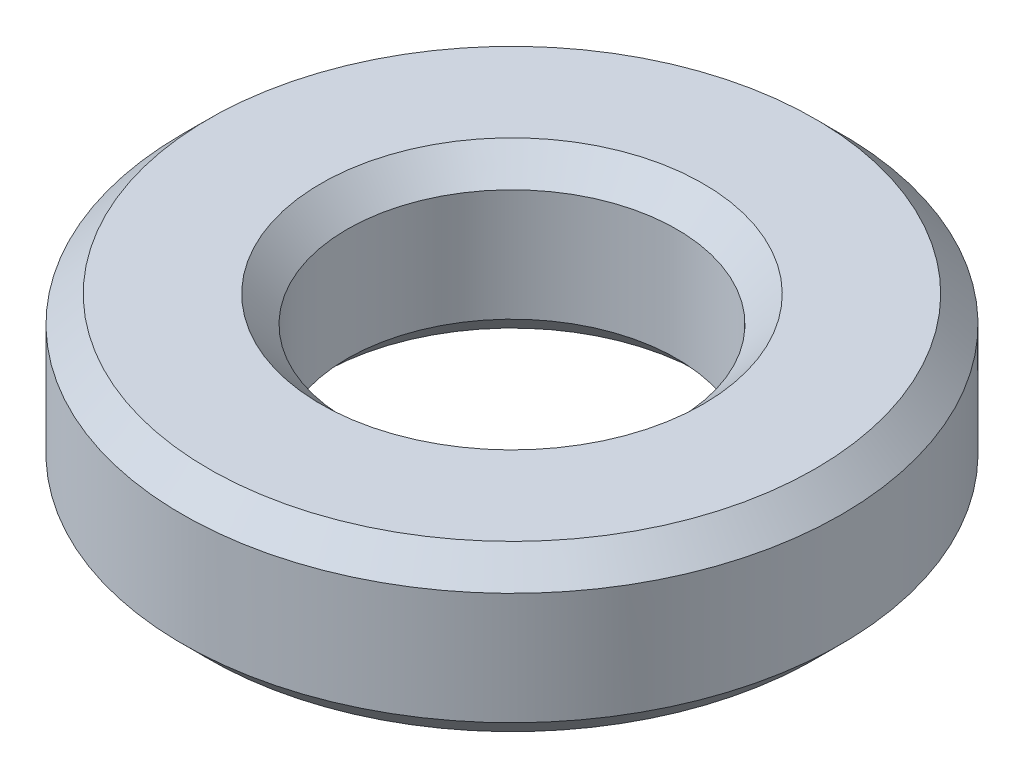
ISO-10303-21;
HEADER;
FILE_DESCRIPTION(('STEP AP214'),'2;1');
FILE_NAME('part.step','',(''),(''),'','','');
FILE_SCHEMA(('AUTOMOTIVE_DESIGN { 1 0 10303 214 1 1 1 1 }'));
ENDSEC;
DATA;
#1=APPLICATION_CONTEXT('core data for automotive mechanical design processes');
#2=APPLICATION_PROTOCOL_DEFINITION('international standard','automotive_design',2000,#1);
#3=PRODUCT_CONTEXT('',#1,'mechanical');
#4=PRODUCT('Part','Part','',(#3));
#5=PRODUCT_RELATED_PRODUCT_CATEGORY('part','',(#4));
#6=PRODUCT_DEFINITION_FORMATION('','',#4);
#7=PRODUCT_DEFINITION_CONTEXT('part definition',#1,'design');
#8=PRODUCT_DEFINITION('design','',#6,#7);
#9=PRODUCT_DEFINITION_SHAPE('','',#8);
#10=(LENGTH_UNIT() NAMED_UNIT(*) SI_UNIT(.MILLI.,.METRE.));
#11=(NAMED_UNIT(*) PLANE_ANGLE_UNIT() SI_UNIT($,.RADIAN.));
#12=(NAMED_UNIT(*) SI_UNIT($,.STERADIAN.) SOLID_ANGLE_UNIT());
#13=UNCERTAINTY_MEASURE_WITH_UNIT(LENGTH_MEASURE(1.E-05),#10,'distance_accuracy_value','');
#14=(GEOMETRIC_REPRESENTATION_CONTEXT(3) GLOBAL_UNCERTAINTY_ASSIGNED_CONTEXT((#13)) GLOBAL_UNIT_ASSIGNED_CONTEXT((#10,
#11,#12)) REPRESENTATION_CONTEXT('',''));
#15=CARTESIAN_POINT('',(0.,0.,0.));
#16=DIRECTION('',(0.,0.,1.));
#17=DIRECTION('',(1.,0.,0.));
#18=AXIS2_PLACEMENT_3D('',#15,#16,#17);
#19=CARTESIAN_POINT('',(1.5875,-0.79375,0.));
#20=DIRECTION('',(0.,1.,0.));
#21=DIRECTION('',(-1.,0.,0.));
#22=AXIS2_PLACEMENT_3D('',#19,#20,#21);
#23=PLANE('',#22);
#24=CARTESIAN_POINT('',(0.,-0.79375,0.));
#25=DIRECTION('',(0.,1.,0.));
#26=DIRECTION('',(-1.,0.,0.));
#27=AXIS2_PLACEMENT_3D('',#24,#25,#26);
#28=CIRCLE('',#27,2.921);
#29=CARTESIAN_POINT('',(-2.921,-0.793750000000001,0.));
#30=VERTEX_POINT('',#29);
#31=EDGE_CURVE('E50',#30,#30,#28,.F.);
#32=ORIENTED_EDGE('',*,*,#31,.T.);
#33=EDGE_LOOP('',(#32));
#34=FACE_BOUND('',#33,.T.);
#35=CARTESIAN_POINT('',(0.,-0.79375,0.));
#36=DIRECTION('',(0.,1.,0.));
#37=DIRECTION('',(-1.,0.,0.));
#38=AXIS2_PLACEMENT_3D('',#35,#36,#37);
#39=CIRCLE('',#38,1.8415);
#40=CARTESIAN_POINT('',(1.8415,-0.79375,0.));
#41=VERTEX_POINT('',#40);
#42=EDGE_CURVE('E53',#41,#41,#39,.T.);
#43=ORIENTED_EDGE('',*,*,#42,.T.);
#44=EDGE_LOOP('',(#43));
#45=FACE_BOUND('',#44,.T.);
#46=ADVANCED_FACE('F30',(#34,#45),#23,.F.);
#47=CARTESIAN_POINT('',(0.,1.64456699346434,0.));
#48=DIRECTION('',(0.,1.,0.));
#49=DIRECTION('',(-1.,0.,0.));
#50=AXIS2_PLACEMENT_3D('',#47,#48,#49);
#51=CYLINDRICAL_SURFACE('',#50,1.5875);
#52=CARTESIAN_POINT('',(0.,0.53975,0.));
#53=DIRECTION('',(0.,-1.,0.));
#54=DIRECTION('',(1.,0.,0.));
#55=AXIS2_PLACEMENT_3D('',#52,#53,#54);
#56=CIRCLE('',#55,1.5875);
#57=CARTESIAN_POINT('',(1.5875,0.539750000000001,0.));
#58=VERTEX_POINT('',#57);
#59=EDGE_CURVE('E10',#58,#58,#56,.F.);
#60=ORIENTED_EDGE('',*,*,#59,.T.);
#61=EDGE_LOOP('',(#60));
#62=FACE_BOUND('',#61,.T.);
#63=CARTESIAN_POINT('',(0.,-0.539749999999998,0.));
#64=DIRECTION('',(0.,1.,0.));
#65=DIRECTION('',(-1.,0.,0.));
#66=AXIS2_PLACEMENT_3D('',#63,#64,#65);
#67=CIRCLE('',#66,1.5875);
#68=CARTESIAN_POINT('',(1.5875,-0.539749999999998,0.));
#69=VERTEX_POINT('',#68);
#70=EDGE_CURVE('E37',#69,#69,#67,.F.);
#71=ORIENTED_EDGE('',*,*,#70,.T.);
#72=EDGE_LOOP('',(#71));
#73=FACE_BOUND('',#72,.T.);
#74=ADVANCED_FACE('F76',(#62,#73),#51,.F.);
#75=CARTESIAN_POINT('',(3.175,0.79375,0.));
#76=DIRECTION('',(0.,-1.,0.));
#77=DIRECTION('',(1.,0.,0.));
#78=AXIS2_PLACEMENT_3D('',#75,#76,#77);
#79=PLANE('',#78);
#80=CARTESIAN_POINT('',(0.,0.793749999999999,0.));
#81=DIRECTION('',(0.,-1.,0.));
#82=DIRECTION('',(1.,0.,0.));
#83=AXIS2_PLACEMENT_3D('',#80,#81,#82);
#84=CIRCLE('',#83,2.921);
#85=CARTESIAN_POINT('',(2.921,0.79375,0.));
#86=VERTEX_POINT('',#85);
#87=EDGE_CURVE('E41',#86,#86,#84,.F.);
#88=ORIENTED_EDGE('',*,*,#87,.T.);
#89=EDGE_LOOP('',(#88));
#90=FACE_BOUND('',#89,.T.);
#91=CARTESIAN_POINT('',(0.,0.793749999999999,0.));
#92=DIRECTION('',(0.,-1.,0.));
#93=DIRECTION('',(1.,0.,0.));
#94=AXIS2_PLACEMENT_3D('',#91,#92,#93);
#95=CIRCLE('',#94,1.8415);
#96=CARTESIAN_POINT('',(1.8415,0.79375,0.));
#97=VERTEX_POINT('',#96);
#98=EDGE_CURVE('E45',#97,#97,#95,.T.);
#99=ORIENTED_EDGE('',*,*,#98,.T.);
#100=EDGE_LOOP('',(#99));
#101=FACE_BOUND('',#100,.T.);
#102=ADVANCED_FACE('F73',(#90,#101),#79,.F.);
#103=CARTESIAN_POINT('',(0.,1.64456699346434,0.));
#104=DIRECTION('',(0.,1.,0.));
#105=DIRECTION('',(-1.,0.,0.));
#106=AXIS2_PLACEMENT_3D('',#103,#104,#105);
#107=CYLINDRICAL_SURFACE('',#106,3.175);
#108=CARTESIAN_POINT('',(0.,-0.53975,0.));
#109=DIRECTION('',(0.,1.,0.));
#110=DIRECTION('',(-1.,0.,0.));
#111=AXIS2_PLACEMENT_3D('',#108,#109,#110);
#112=CIRCLE('',#111,3.175);
#113=CARTESIAN_POINT('',(-3.175,-0.539750000000001,0.));
#114=VERTEX_POINT('',#113);
#115=EDGE_CURVE('E56',#114,#114,#112,.T.);
#116=ORIENTED_EDGE('',*,*,#115,.T.);
#117=EDGE_LOOP('',(#116));
#118=FACE_BOUND('',#117,.T.);
#119=CARTESIAN_POINT('',(0.,0.539749999999998,0.));
#120=DIRECTION('',(0.,-1.,0.));
#121=DIRECTION('',(1.,0.,0.));
#122=AXIS2_PLACEMENT_3D('',#119,#120,#121);
#123=CIRCLE('',#122,3.175);
#124=CARTESIAN_POINT('',(3.175,0.539749999999999,0.));
#125=VERTEX_POINT('',#124);
#126=EDGE_CURVE('E59',#125,#125,#123,.T.);
#127=ORIENTED_EDGE('',*,*,#126,.T.);
#128=EDGE_LOOP('',(#127));
#129=FACE_BOUND('',#128,.T.);
#130=ADVANCED_FACE('F63',(#118,#129),#107,.T.);
#131=CARTESIAN_POINT('',(0.,-0.53975,0.));
#132=DIRECTION('',(0.,1.,0.));
#133=DIRECTION('',(-1.,0.,0.));
#134=AXIS2_PLACEMENT_3D('',#131,#132,#133);
#135=CONICAL_SURFACE('',#134,3.175,0.785398163397452);
#136=ORIENTED_EDGE('',*,*,#31,.F.);
#137=EDGE_LOOP('',(#136));
#138=FACE_BOUND('',#137,.T.);
#139=ORIENTED_EDGE('',*,*,#115,.F.);
#140=EDGE_LOOP('',(#139));
#141=FACE_BOUND('',#140,.T.);
#142=ADVANCED_FACE('F69',(#138,#141),#135,.T.);
#143=CARTESIAN_POINT('',(0.,0.793749999999999,0.));
#144=DIRECTION('',(0.,-1.,0.));
#145=DIRECTION('',(1.,0.,0.));
#146=AXIS2_PLACEMENT_3D('',#143,#144,#145);
#147=CONICAL_SURFACE('',#146,2.921,0.785398163397447);
#148=ORIENTED_EDGE('',*,*,#126,.F.);
#149=EDGE_LOOP('',(#148));
#150=FACE_BOUND('',#149,.T.);
#151=ORIENTED_EDGE('',*,*,#87,.F.);
#152=EDGE_LOOP('',(#151));
#153=FACE_BOUND('',#152,.T.);
#154=ADVANCED_FACE('F65',(#150,#153),#147,.T.);
#155=CARTESIAN_POINT('',(0.,0.53975,0.));
#156=DIRECTION('',(0.,1.,0.));
#157=DIRECTION('',(-1.,0.,0.));
#158=AXIS2_PLACEMENT_3D('',#155,#156,#157);
#159=CONICAL_SURFACE('',#158,1.5875,0.785398163397451);
#160=ORIENTED_EDGE('',*,*,#98,.F.);
#161=EDGE_LOOP('',(#160));
#162=FACE_BOUND('',#161,.T.);
#163=ORIENTED_EDGE('',*,*,#59,.F.);
#164=EDGE_LOOP('',(#163));
#165=FACE_BOUND('',#164,.T.);
#166=ADVANCED_FACE('F68',(#162,#165),#159,.F.);
#167=CARTESIAN_POINT('',(0.,-0.79375,0.));
#168=DIRECTION('',(0.,-1.,0.));
#169=DIRECTION('',(1.,0.,0.));
#170=AXIS2_PLACEMENT_3D('',#167,#168,#169);
#171=CONICAL_SURFACE('',#170,1.8415,0.785398163397446);
#172=CARTESIAN_POINT('',(1.5875,-0.539749999999998,0.));
#173=CARTESIAN_POINT('',(1.59014583333333,-0.542395833333331,0.));
#174=CARTESIAN_POINT('',(1.59279166666667,-0.545041666666664,0.));
#175=CARTESIAN_POINT('',(1.59808333333333,-0.550333333333331,0.));
#176=CARTESIAN_POINT('',(1.60072916666667,-0.552979166666664,0.));
#177=CARTESIAN_POINT('',(1.60602083333333,-0.558270833333331,0.));
#178=CARTESIAN_POINT('',(1.60866666666667,-0.560916666666665,0.));
#179=CARTESIAN_POINT('',(1.61395833333333,-0.566208333333331,0.));
#180=CARTESIAN_POINT('',(1.61660416666667,-0.568854166666665,0.));
#181=CARTESIAN_POINT('',(1.62189583333333,-0.574145833333331,0.));
#182=CARTESIAN_POINT('',(1.62454166666667,-0.576791666666665,0.));
#183=CARTESIAN_POINT('',(1.62983333333333,-0.582083333333331,0.));
#184=CARTESIAN_POINT('',(1.63247916666667,-0.584729166666665,0.));
#185=CARTESIAN_POINT('',(1.63777083333333,-0.590020833333331,0.));
#186=CARTESIAN_POINT('',(1.64041666666667,-0.592666666666665,0.));
#187=CARTESIAN_POINT('',(1.64570833333333,-0.597958333333331,0.));
#188=CARTESIAN_POINT('',(1.64835416666667,-0.600604166666665,0.));
#189=CARTESIAN_POINT('',(1.65364583333333,-0.605895833333331,0.));
#190=CARTESIAN_POINT('',(1.65629166666667,-0.608541666666665,0.));
#191=CARTESIAN_POINT('',(1.66158333333333,-0.613833333333331,0.));
#192=CARTESIAN_POINT('',(1.66422916666667,-0.616479166666665,0.));
#193=CARTESIAN_POINT('',(1.66952083333333,-0.621770833333332,0.));
#194=CARTESIAN_POINT('',(1.67216666666667,-0.624416666666665,0.));
#195=CARTESIAN_POINT('',(1.67745833333333,-0.629708333333332,0.));
#196=CARTESIAN_POINT('',(1.68010416666667,-0.632354166666665,0.));
#197=CARTESIAN_POINT('',(1.68539583333333,-0.637645833333332,0.));
#198=CARTESIAN_POINT('',(1.68804166666667,-0.640291666666665,0.));
#199=CARTESIAN_POINT('',(1.69333333333333,-0.645583333333332,0.));
#200=CARTESIAN_POINT('',(1.69597916666667,-0.648229166666665,0.));
#201=CARTESIAN_POINT('',(1.70127083333333,-0.653520833333332,0.));
#202=CARTESIAN_POINT('',(1.70391666666667,-0.656166666666665,0.));
#203=CARTESIAN_POINT('',(1.70920833333333,-0.661458333333332,0.));
#204=CARTESIAN_POINT('',(1.71185416666667,-0.664104166666665,0.));
#205=CARTESIAN_POINT('',(1.71714583333333,-0.669395833333332,0.));
#206=CARTESIAN_POINT('',(1.71979166666667,-0.672041666666665,0.));
#207=CARTESIAN_POINT('',(1.72508333333333,-0.677333333333332,0.));
#208=CARTESIAN_POINT('',(1.72772916666667,-0.679979166666665,0.));
#209=CARTESIAN_POINT('',(1.73302083333333,-0.685270833333332,0.));
#210=CARTESIAN_POINT('',(1.73566666666667,-0.687916666666666,0.));
#211=CARTESIAN_POINT('',(1.74095833333333,-0.693208333333332,0.));
#212=CARTESIAN_POINT('',(1.74360416666667,-0.695854166666666,0.));
#213=CARTESIAN_POINT('',(1.74889583333333,-0.701145833333332,0.));
#214=CARTESIAN_POINT('',(1.75154166666667,-0.703791666666666,0.));
#215=CARTESIAN_POINT('',(1.75683333333333,-0.709083333333332,0.));
#216=CARTESIAN_POINT('',(1.75947916666667,-0.711729166666666,0.));
#217=CARTESIAN_POINT('',(1.76477083333333,-0.717020833333332,0.));
#218=CARTESIAN_POINT('',(1.76741666666667,-0.719666666666666,0.));
#219=CARTESIAN_POINT('',(1.77270833333333,-0.724958333333333,0.));
#220=CARTESIAN_POINT('',(1.77535416666667,-0.727604166666666,0.));
#221=CARTESIAN_POINT('',(1.78064583333333,-0.732895833333333,0.));
#222=CARTESIAN_POINT('',(1.78329166666667,-0.735541666666666,0.));
#223=CARTESIAN_POINT('',(1.78858333333333,-0.740833333333333,0.));
#224=CARTESIAN_POINT('',(1.79122916666667,-0.743479166666666,0.));
#225=CARTESIAN_POINT('',(1.79652083333333,-0.748770833333333,0.));
#226=CARTESIAN_POINT('',(1.79916666666667,-0.751416666666666,0.));
#227=CARTESIAN_POINT('',(1.80445833333333,-0.756708333333333,0.));
#228=CARTESIAN_POINT('',(1.80710416666667,-0.759354166666666,0.));
#229=CARTESIAN_POINT('',(1.81239583333333,-0.764645833333333,0.));
#230=CARTESIAN_POINT('',(1.81504166666667,-0.767291666666666,0.));
#231=CARTESIAN_POINT('',(1.82033333333333,-0.772583333333333,0.));
#232=CARTESIAN_POINT('',(1.82297916666667,-0.775229166666666,0.));
#233=CARTESIAN_POINT('',(1.82827083333333,-0.780520833333333,0.));
#234=CARTESIAN_POINT('',(1.83091666666667,-0.783166666666666,0.));
#235=CARTESIAN_POINT('',(1.83620833333333,-0.788458333333333,0.));
#236=CARTESIAN_POINT('',(1.83885416666667,-0.791104166666666,0.));
#237=CARTESIAN_POINT('',(1.8415,-0.79375,0.));
#238=B_SPLINE_CURVE_WITH_KNOTS('',3,(#172,#173,#174,#175,#176,#177,#178,#179,#180,#181,#182,
#183,#184,#185,#186,#187,#188,#189,#190,#191,#192,#193,#194,#195,#196,#197,#198,#199,#200,#201,
#202,#203,#204,#205,#206,#207,#208,#209,#210,#211,#212,#213,#214,#215,#216,#217,#218,#219,#220,
#221,#222,#223,#224,#225,#226,#227,#228,#229,#230,#231,#232,#233,#234,#235,#236,#237),
.UNSPECIFIED.,.F.,.F.,(4,2,2,2,2,2,2,2,2,2,2,2,2,2,2,2,2,2,2,2,2,2,2,2,2,2,2,2,2,2,2,2,4),(0.,
0.0112253201513364,0.0224506403026729,0.0336759604540094,0.044901280605346,0.0561266007566824,
0.067351920908019,0.0785772410593555,0.089802561210692,0.101027881362029,0.112253201513365,
0.123478521664702,0.134703841816038,0.145929161967375,0.157154482118711,0.168379802270048,
0.179605122421384,0.190830442572721,0.202055762724057,0.213281082875394,0.22450640302673,
0.235731723178067,0.246957043329403,0.25818236348074,0.269407683632076,0.280633003783413,
0.291858323934749,0.303083644086086,0.314308964237422,0.325534284388759,0.336759604540095,
0.347984924691432,0.359210244842768),.UNSPECIFIED.);
#239=EDGE_CURVE('BSEAM32',#69,#41,#238,.T.);
#240=ORIENTED_EDGE('',*,*,#70,.F.);
#241=ORIENTED_EDGE('',*,*,#42,.F.);
#242=ORIENTED_EDGE('',*,*,#239,.T.);
#243=ORIENTED_EDGE('',*,*,#239,.F.);
#244=EDGE_LOOP('',(#240,#242,#241,#243));
#245=FACE_BOUND('',#244,.T.);
#246=ADVANCED_FACE('F32',(#245),#171,.F.);
#247=CLOSED_SHELL('',(#46,#74,#102,#130,#142,#154,#166,#246));
#248=MANIFOLD_SOLID_BREP('B2',#247);
#249=ADVANCED_BREP_SHAPE_REPRESENTATION('',(#18,#248),#14);
#250=SHAPE_DEFINITION_REPRESENTATION(#9,#249);
ENDSEC;
END-ISO-10303-21;
